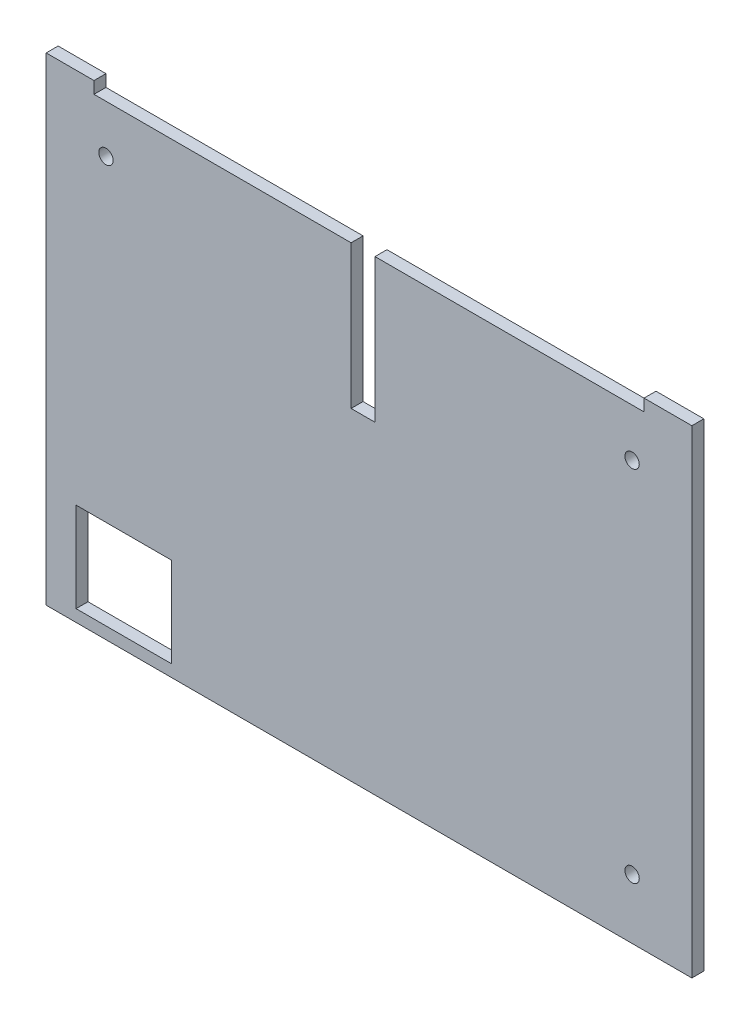
ISO-10303-21;
HEADER;
FILE_DESCRIPTION(('STEP AP214'),'2;1');
FILE_NAME('part.step','',(''),(''),'','','');
FILE_SCHEMA(('AUTOMOTIVE_DESIGN { 1 0 10303 214 1 1 1 1 }'));
ENDSEC;
DATA;
#1=APPLICATION_CONTEXT('core data for automotive mechanical design processes');
#2=APPLICATION_PROTOCOL_DEFINITION('international standard','automotive_design',2000,#1);
#3=PRODUCT_CONTEXT('',#1,'mechanical');
#4=PRODUCT('Part','Part','',(#3));
#5=PRODUCT_RELATED_PRODUCT_CATEGORY('part','',(#4));
#6=PRODUCT_DEFINITION_FORMATION('','',#4);
#7=PRODUCT_DEFINITION_CONTEXT('part definition',#1,'design');
#8=PRODUCT_DEFINITION('design','',#6,#7);
#9=PRODUCT_DEFINITION_SHAPE('','',#8);
#10=(LENGTH_UNIT() NAMED_UNIT(*) SI_UNIT(.MILLI.,.METRE.));
#11=(NAMED_UNIT(*) PLANE_ANGLE_UNIT() SI_UNIT($,.RADIAN.));
#12=(NAMED_UNIT(*) SI_UNIT($,.STERADIAN.) SOLID_ANGLE_UNIT());
#13=UNCERTAINTY_MEASURE_WITH_UNIT(LENGTH_MEASURE(1.E-05),#10,'distance_accuracy_value','');
#14=(GEOMETRIC_REPRESENTATION_CONTEXT(3) GLOBAL_UNCERTAINTY_ASSIGNED_CONTEXT((#13)) GLOBAL_UNIT_ASSIGNED_CONTEXT((#10,
#11,#12)) REPRESENTATION_CONTEXT('',''));
#15=CARTESIAN_POINT('',(0.,0.,0.));
#16=DIRECTION('',(0.,0.,1.));
#17=DIRECTION('',(1.,0.,0.));
#18=AXIS2_PLACEMENT_3D('',#15,#16,#17);
#19=CARTESIAN_POINT('',(0.,95.0000000000001,0.));
#20=DIRECTION('',(0.,1.,0.));
#21=DIRECTION('',(0.,0.,1.));
#22=AXIS2_PLACEMENT_3D('',#19,#20,#21);
#23=PLANE('',#22);
#24=DIRECTION('',(-1.,0.,0.));
#25=VECTOR('',#24,1.);
#26=CARTESIAN_POINT('',(-115.,95.0000000000001,0.));
#27=LINE('',#26,#25);
#28=CARTESIAN_POINT('',(115.,95.0000000000001,0.));
#29=VERTEX_POINT('',#28);
#30=CARTESIAN_POINT('',(2.5,95.0000000000001,0.));
#31=VERTEX_POINT('',#30);
#32=EDGE_CURVE('E185',#29,#31,#27,.T.);
#33=ORIENTED_EDGE('',*,*,#32,.T.);
#34=DIRECTION('',(0.,0.,-1.));
#35=VECTOR('',#34,1.);
#36=CARTESIAN_POINT('',(2.5,95.0000000000001,0.));
#37=LINE('',#36,#35);
#38=CARTESIAN_POINT('',(2.5,95.0000000000001,5.));
#39=VERTEX_POINT('',#38);
#40=EDGE_CURVE('E163',#39,#31,#37,.T.);
#41=ORIENTED_EDGE('',*,*,#40,.F.);
#42=DIRECTION('',(1.,0.,0.));
#43=VECTOR('',#42,1.);
#44=CARTESIAN_POINT('',(-115.,95.0000000000001,5.));
#45=LINE('',#44,#43);
#46=CARTESIAN_POINT('',(115.,95.0000000000001,5.));
#47=VERTEX_POINT('',#46);
#48=EDGE_CURVE('E162',#39,#47,#45,.T.);
#49=ORIENTED_EDGE('',*,*,#48,.T.);
#50=DIRECTION('',(0.,0.,-1.));
#51=VECTOR('',#50,1.);
#52=CARTESIAN_POINT('',(115.,95.0000000000001,0.));
#53=LINE('',#52,#51);
#54=EDGE_CURVE('E182',#47,#29,#53,.T.);
#55=ORIENTED_EDGE('',*,*,#54,.T.);
#56=EDGE_LOOP('',(#33,#41,#49,#55));
#57=FACE_BOUND('',#56,.T.);
#58=ADVANCED_FACE('F34',(#57),#23,.T.);
#59=CARTESIAN_POINT('',(0.,100.,5.));
#60=DIRECTION('',(0.,1.,0.));
#61=DIRECTION('',(0.,0.,1.));
#62=AXIS2_PLACEMENT_3D('',#59,#60,#61);
#63=PLANE('',#62);
#64=DIRECTION('',(0.,0.,1.));
#65=VECTOR('',#64,1.);
#66=CARTESIAN_POINT('',(-115.,100.,0.));
#67=LINE('',#66,#65);
#68=CARTESIAN_POINT('',(-115.,100.,0.));
#69=VERTEX_POINT('',#68);
#70=CARTESIAN_POINT('',(-115.,100.,5.));
#71=VERTEX_POINT('',#70);
#72=EDGE_CURVE('E168',#69,#71,#67,.T.);
#73=ORIENTED_EDGE('',*,*,#72,.F.);
#74=DIRECTION('',(1.,0.,0.));
#75=VECTOR('',#74,1.);
#76=CARTESIAN_POINT('',(0.,100.,0.));
#77=LINE('',#76,#75);
#78=CARTESIAN_POINT('',(-135.,100.,0.));
#79=VERTEX_POINT('',#78);
#80=EDGE_CURVE('E251',#79,#69,#77,.T.);
#81=ORIENTED_EDGE('',*,*,#80,.F.);
#82=DIRECTION('',(0.,0.,-1.));
#83=VECTOR('',#82,1.);
#84=CARTESIAN_POINT('',(-135.,100.,5.));
#85=LINE('',#84,#83);
#86=CARTESIAN_POINT('',(-135.,100.,5.));
#87=VERTEX_POINT('',#86);
#88=EDGE_CURVE('E249',#87,#79,#85,.T.);
#89=ORIENTED_EDGE('',*,*,#88,.F.);
#90=DIRECTION('',(1.,0.,0.));
#91=VECTOR('',#90,1.);
#92=CARTESIAN_POINT('',(0.,100.,5.));
#93=LINE('',#92,#91);
#94=EDGE_CURVE('E246',#87,#71,#93,.T.);
#95=ORIENTED_EDGE('',*,*,#94,.T.);
#96=EDGE_LOOP('',(#73,#81,#89,#95));
#97=FACE_BOUND('',#96,.T.);
#98=ADVANCED_FACE('F307',(#97),#63,.T.);
#99=CARTESIAN_POINT('',(0.,-99.9999999999999,5.));
#100=DIRECTION('',(0.,1.,0.));
#101=DIRECTION('',(0.,0.,1.));
#102=AXIS2_PLACEMENT_3D('',#99,#100,#101);
#103=PLANE('',#102);
#104=DIRECTION('',(1.,0.,0.));
#105=VECTOR('',#104,1.);
#106=CARTESIAN_POINT('',(0.,-99.9999999999999,0.));
#107=LINE('',#106,#105);
#108=CARTESIAN_POINT('',(-135.,-99.9999999999999,0.));
#109=VERTEX_POINT('',#108);
#110=CARTESIAN_POINT('',(135.,-99.9999999999999,0.));
#111=VERTEX_POINT('',#110);
#112=EDGE_CURVE('E234',#109,#111,#107,.T.);
#113=ORIENTED_EDGE('',*,*,#112,.T.);
#114=DIRECTION('',(0.,0.,-1.));
#115=VECTOR('',#114,1.);
#116=CARTESIAN_POINT('',(135.,-99.9999999999999,5.));
#117=LINE('',#116,#115);
#118=CARTESIAN_POINT('',(135.,-99.9999999999999,5.));
#119=VERTEX_POINT('',#118);
#120=EDGE_CURVE('E264',#119,#111,#117,.T.);
#121=ORIENTED_EDGE('',*,*,#120,.F.);
#122=DIRECTION('',(1.,0.,0.));
#123=VECTOR('',#122,1.);
#124=CARTESIAN_POINT('',(0.,-99.9999999999999,5.));
#125=LINE('',#124,#123);
#126=CARTESIAN_POINT('',(-135.,-99.9999999999999,5.));
#127=VERTEX_POINT('',#126);
#128=EDGE_CURVE('E239',#127,#119,#125,.T.);
#129=ORIENTED_EDGE('',*,*,#128,.F.);
#130=DIRECTION('',(0.,0.,-1.));
#131=VECTOR('',#130,1.);
#132=CARTESIAN_POINT('',(-135.,-99.9999999999999,5.));
#133=LINE('',#132,#131);
#134=EDGE_CURVE('E266',#127,#109,#133,.T.);
#135=ORIENTED_EDGE('',*,*,#134,.T.);
#136=EDGE_LOOP('',(#113,#121,#129,#135));
#137=FACE_BOUND('',#136,.T.);
#138=ADVANCED_FACE('F36',(#137),#103,.F.);
#139=CARTESIAN_POINT('',(135.,0.,5.));
#140=DIRECTION('',(1.,0.,0.));
#141=DIRECTION('',(0.,1.,0.));
#142=AXIS2_PLACEMENT_3D('',#139,#140,#141);
#143=PLANE('',#142);
#144=DIRECTION('',(0.,-1.,0.));
#145=VECTOR('',#144,1.);
#146=CARTESIAN_POINT('',(135.,0.,0.));
#147=LINE('',#146,#145);
#148=CARTESIAN_POINT('',(135.,100.,0.));
#149=VERTEX_POINT('',#148);
#150=EDGE_CURVE('E254',#149,#111,#147,.T.);
#151=ORIENTED_EDGE('',*,*,#150,.F.);
#152=DIRECTION('',(0.,0.,-1.));
#153=VECTOR('',#152,1.);
#154=CARTESIAN_POINT('',(135.,100.,5.));
#155=LINE('',#154,#153);
#156=CARTESIAN_POINT('',(135.,100.,5.));
#157=VERTEX_POINT('',#156);
#158=EDGE_CURVE('E261',#157,#149,#155,.T.);
#159=ORIENTED_EDGE('',*,*,#158,.F.);
#160=DIRECTION('',(0.,-1.,0.));
#161=VECTOR('',#160,1.);
#162=CARTESIAN_POINT('',(135.,0.,5.));
#163=LINE('',#162,#161);
#164=EDGE_CURVE('E242',#157,#119,#163,.T.);
#165=ORIENTED_EDGE('',*,*,#164,.T.);
#166=ORIENTED_EDGE('',*,*,#120,.T.);
#167=EDGE_LOOP('',(#151,#159,#165,#166));
#168=FACE_BOUND('',#167,.T.);
#169=ADVANCED_FACE('F364',(#168),#143,.T.);
#170=DIRECTION('',(0.,0.,-1.));
#171=VECTOR('',#170,1.);
#172=CARTESIAN_POINT('',(115.,100.,0.));
#173=LINE('',#172,#171);
#174=CARTESIAN_POINT('',(115.,100.,5.));
#175=VERTEX_POINT('',#174);
#176=CARTESIAN_POINT('',(115.,100.,0.));
#177=VERTEX_POINT('',#176);
#178=EDGE_CURVE('E171',#175,#177,#173,.T.);
#179=ORIENTED_EDGE('',*,*,#178,.F.);
#180=EDGE_CURVE('E245',#175,#157,#93,.T.);
#181=ORIENTED_EDGE('',*,*,#180,.T.);
#182=ORIENTED_EDGE('',*,*,#158,.T.);
#183=EDGE_CURVE('E257',#177,#149,#77,.T.);
#184=ORIENTED_EDGE('',*,*,#183,.F.);
#185=EDGE_LOOP('',(#179,#181,#182,#184));
#186=FACE_BOUND('',#185,.T.);
#187=ADVANCED_FACE('F318',(#186),#63,.T.);
#188=CARTESIAN_POINT('',(-135.,0.,5.));
#189=DIRECTION('',(1.,0.,0.));
#190=DIRECTION('',(0.,1.,0.));
#191=AXIS2_PLACEMENT_3D('',#188,#189,#190);
#192=PLANE('',#191);
#193=DIRECTION('',(0.,-1.,0.));
#194=VECTOR('',#193,1.);
#195=CARTESIAN_POINT('',(-135.,0.,0.));
#196=LINE('',#195,#194);
#197=EDGE_CURVE('E240',#79,#109,#196,.T.);
#198=ORIENTED_EDGE('',*,*,#197,.T.);
#199=ORIENTED_EDGE('',*,*,#134,.F.);
#200=DIRECTION('',(0.,-1.,0.));
#201=VECTOR('',#200,1.);
#202=CARTESIAN_POINT('',(-135.,0.,5.));
#203=LINE('',#202,#201);
#204=EDGE_CURVE('E237',#87,#127,#203,.T.);
#205=ORIENTED_EDGE('',*,*,#204,.F.);
#206=ORIENTED_EDGE('',*,*,#88,.T.);
#207=EDGE_LOOP('',(#198,#199,#205,#206));
#208=FACE_BOUND('',#207,.T.);
#209=ADVANCED_FACE('F368',(#208),#192,.F.);
#210=CARTESIAN_POINT('',(0.,0.,5.));
#211=DIRECTION('',(0.,0.,1.));
#212=DIRECTION('',(1.,0.,0.));
#213=AXIS2_PLACEMENT_3D('',#210,#211,#212);
#214=PLANE('',#213);
#215=ORIENTED_EDGE('',*,*,#48,.F.);
#216=DIRECTION('',(0.,1.,0.));
#217=VECTOR('',#216,1.);
#218=CARTESIAN_POINT('',(2.5,95.0000000000001,5.));
#219=LINE('',#218,#217);
#220=CARTESIAN_POINT('',(2.49999999999998,35.0000000000001,5.));
#221=VERTEX_POINT('',#220);
#222=EDGE_CURVE('E149',#221,#39,#219,.T.);
#223=ORIENTED_EDGE('',*,*,#222,.F.);
#224=DIRECTION('',(1.,0.,0.));
#225=VECTOR('',#224,1.);
#226=CARTESIAN_POINT('',(0.,35.0000000000001,5.));
#227=LINE('',#226,#225);
#228=CARTESIAN_POINT('',(-7.50000000000001,35.0000000000001,5.));
#229=VERTEX_POINT('',#228);
#230=EDGE_CURVE('E160',#229,#221,#227,.T.);
#231=ORIENTED_EDGE('',*,*,#230,.F.);
#232=DIRECTION('',(0.,-1.,0.));
#233=VECTOR('',#232,1.);
#234=CARTESIAN_POINT('',(-7.50000000000001,0.,5.));
#235=LINE('',#234,#233);
#236=CARTESIAN_POINT('',(-7.5,95.0000000000001,5.));
#237=VERTEX_POINT('',#236);
#238=EDGE_CURVE('E169',#237,#229,#235,.T.);
#239=ORIENTED_EDGE('',*,*,#238,.F.);
#240=CARTESIAN_POINT('',(-115.,95.0000000000001,5.));
#241=VERTEX_POINT('',#240);
#242=EDGE_CURVE('E179',#241,#237,#45,.T.);
#243=ORIENTED_EDGE('',*,*,#242,.F.);
#244=DIRECTION('',(0.,1.,0.));
#245=VECTOR('',#244,1.);
#246=CARTESIAN_POINT('',(-115.,95.0000000000001,5.));
#247=LINE('',#246,#245);
#248=EDGE_CURVE('E186',#241,#71,#247,.T.);
#249=ORIENTED_EDGE('',*,*,#248,.T.);
#250=ORIENTED_EDGE('',*,*,#94,.F.);
#251=ORIENTED_EDGE('',*,*,#204,.T.);
#252=ORIENTED_EDGE('',*,*,#128,.T.);
#253=ORIENTED_EDGE('',*,*,#164,.F.);
#254=ORIENTED_EDGE('',*,*,#180,.F.);
#255=DIRECTION('',(0.,1.,0.));
#256=VECTOR('',#255,1.);
#257=CARTESIAN_POINT('',(115.,95.0000000000001,5.));
#258=LINE('',#257,#256);
#259=EDGE_CURVE('E195',#47,#175,#258,.T.);
#260=ORIENTED_EDGE('',*,*,#259,.F.);
#261=EDGE_LOOP('',(#215,#223,#231,#239,#243,#249,#250,#251,#252,#253,#254,#260));
#262=FACE_BOUND('',#261,.T.);
#263=DIRECTION('',(0.,1.,0.));
#264=VECTOR('',#263,1.);
#265=CARTESIAN_POINT('',(-82.4999999999999,-94.9999999999999,5.));
#266=LINE('',#265,#264);
#267=CARTESIAN_POINT('',(-82.4999999999999,-94.9999999999999,5.));
#268=VERTEX_POINT('',#267);
#269=CARTESIAN_POINT('',(-82.4999999999999,-57.5000000000002,5.));
#270=VERTEX_POINT('',#269);
#271=EDGE_CURVE('E191',#268,#270,#266,.T.);
#272=ORIENTED_EDGE('',*,*,#271,.F.);
#273=DIRECTION('',(1.,0.,0.));
#274=VECTOR('',#273,1.);
#275=CARTESIAN_POINT('',(-82.4999999999999,-94.9999999999999,5.));
#276=LINE('',#275,#274);
#277=CARTESIAN_POINT('',(-122.5,-94.9999999999999,5.));
#278=VERTEX_POINT('',#277);
#279=EDGE_CURVE('E206',#278,#268,#276,.T.);
#280=ORIENTED_EDGE('',*,*,#279,.F.);
#281=DIRECTION('',(0.,-1.,0.));
#282=VECTOR('',#281,1.);
#283=CARTESIAN_POINT('',(-122.5,-94.9999999999999,5.));
#284=LINE('',#283,#282);
#285=CARTESIAN_POINT('',(-122.5,-57.5000000000002,5.));
#286=VERTEX_POINT('',#285);
#287=EDGE_CURVE('E203',#286,#278,#284,.T.);
#288=ORIENTED_EDGE('',*,*,#287,.F.);
#289=DIRECTION('',(-1.,0.,0.));
#290=VECTOR('',#289,1.);
#291=CARTESIAN_POINT('',(-82.4999999999999,-57.5000000000002,5.));
#292=LINE('',#291,#290);
#293=EDGE_CURVE('E200',#270,#286,#292,.T.);
#294=ORIENTED_EDGE('',*,*,#293,.F.);
#295=EDGE_LOOP('',(#272,#280,#288,#294));
#296=FACE_BOUND('',#295,.T.);
#297=CARTESIAN_POINT('',(110.,75.,5.));
#298=DIRECTION('',(0.,0.,-1.));
#299=DIRECTION('',(1.,0.,0.));
#300=AXIS2_PLACEMENT_3D('',#297,#298,#299);
#301=CIRCLE('',#300,3.00000000000001);
#302=CARTESIAN_POINT('',(113.,75.,5.));
#303=VERTEX_POINT('',#302);
#304=EDGE_CURVE('E212',#303,#303,#301,.T.);
#305=ORIENTED_EDGE('',*,*,#304,.T.);
#306=EDGE_LOOP('',(#305));
#307=FACE_BOUND('',#306,.T.);
#308=CARTESIAN_POINT('',(-110.,75.,5.));
#309=DIRECTION('',(0.,0.,1.));
#310=DIRECTION('',(-1.,0.,0.));
#311=AXIS2_PLACEMENT_3D('',#308,#309,#310);
#312=CIRCLE('',#311,3.00000000000001);
#313=CARTESIAN_POINT('',(-113.,75.,5.));
#314=VERTEX_POINT('',#313);
#315=EDGE_CURVE('E222',#314,#314,#312,.T.);
#316=ORIENTED_EDGE('',*,*,#315,.F.);
#317=EDGE_LOOP('',(#316));
#318=FACE_BOUND('',#317,.T.);
#319=CARTESIAN_POINT('',(110.,-75.,5.));
#320=DIRECTION('',(0.,0.,1.));
#321=DIRECTION('',(1.,0.,0.));
#322=AXIS2_PLACEMENT_3D('',#319,#320,#321);
#323=CIRCLE('',#322,3.00000000000001);
#324=CARTESIAN_POINT('',(113.,-75.,5.));
#325=VERTEX_POINT('',#324);
#326=EDGE_CURVE('E228',#325,#325,#323,.T.);
#327=ORIENTED_EDGE('',*,*,#326,.F.);
#328=EDGE_LOOP('',(#327));
#329=FACE_BOUND('',#328,.T.);
#330=ADVANCED_FACE('F157',(#262,#296,#307,#318,#329),#214,.T.);
#331=CARTESIAN_POINT('',(0.,0.,0.));
#332=DIRECTION('',(0.,0.,1.));
#333=DIRECTION('',(1.,0.,0.));
#334=AXIS2_PLACEMENT_3D('',#331,#332,#333);
#335=PLANE('',#334);
#336=DIRECTION('',(-1.,0.,0.));
#337=VECTOR('',#336,1.);
#338=CARTESIAN_POINT('',(7.49999999999998,35.0000000000001,0.));
#339=LINE('',#338,#337);
#340=CARTESIAN_POINT('',(2.49999999999998,35.0000000000001,0.));
#341=VERTEX_POINT('',#340);
#342=CARTESIAN_POINT('',(-7.50000000000001,35.0000000000001,0.));
#343=VERTEX_POINT('',#342);
#344=EDGE_CURVE('E346',#341,#343,#339,.T.);
#345=ORIENTED_EDGE('',*,*,#344,.F.);
#346=DIRECTION('',(0.,-1.,0.));
#347=VECTOR('',#346,1.);
#348=CARTESIAN_POINT('',(2.5,95.0000000000001,0.));
#349=LINE('',#348,#347);
#350=EDGE_CURVE('E49',#31,#341,#349,.T.);
#351=ORIENTED_EDGE('',*,*,#350,.F.);
#352=ORIENTED_EDGE('',*,*,#32,.F.);
#353=DIRECTION('',(0.,1.,0.));
#354=VECTOR('',#353,1.);
#355=CARTESIAN_POINT('',(115.,95.0000000000001,0.));
#356=LINE('',#355,#354);
#357=EDGE_CURVE('E192',#29,#177,#356,.T.);
#358=ORIENTED_EDGE('',*,*,#357,.T.);
#359=ORIENTED_EDGE('',*,*,#183,.T.);
#360=ORIENTED_EDGE('',*,*,#150,.T.);
#361=ORIENTED_EDGE('',*,*,#112,.F.);
#362=ORIENTED_EDGE('',*,*,#197,.F.);
#363=ORIENTED_EDGE('',*,*,#80,.T.);
#364=DIRECTION('',(0.,1.,0.));
#365=VECTOR('',#364,1.);
#366=CARTESIAN_POINT('',(-115.,95.0000000000001,0.));
#367=LINE('',#366,#365);
#368=CARTESIAN_POINT('',(-115.,95.0000000000001,0.));
#369=VERTEX_POINT('',#368);
#370=EDGE_CURVE('E189',#369,#69,#367,.T.);
#371=ORIENTED_EDGE('',*,*,#370,.F.);
#372=CARTESIAN_POINT('',(-7.50000000000001,95.0000000000001,0.));
#373=VERTEX_POINT('',#372);
#374=EDGE_CURVE('E184',#373,#369,#27,.T.);
#375=ORIENTED_EDGE('',*,*,#374,.F.);
#376=DIRECTION('',(0.,1.,0.));
#377=VECTOR('',#376,1.);
#378=CARTESIAN_POINT('',(-7.5,95.0000000000001,0.));
#379=LINE('',#378,#377);
#380=EDGE_CURVE('E56',#343,#373,#379,.T.);
#381=ORIENTED_EDGE('',*,*,#380,.F.);
#382=EDGE_LOOP('',(#345,#351,#352,#358,#359,#360,#361,#362,#363,#371,#375,#381));
#383=FACE_BOUND('',#382,.T.);
#384=CARTESIAN_POINT('',(110.,-75.,0.));
#385=DIRECTION('',(0.,0.,1.));
#386=DIRECTION('',(1.,0.,0.));
#387=AXIS2_PLACEMENT_3D('',#384,#385,#386);
#388=CIRCLE('',#387,3.00000000000001);
#389=CARTESIAN_POINT('',(113.,-75.,0.));
#390=VERTEX_POINT('',#389);
#391=EDGE_CURVE('E231',#390,#390,#388,.T.);
#392=ORIENTED_EDGE('',*,*,#391,.T.);
#393=EDGE_LOOP('',(#392));
#394=FACE_BOUND('',#393,.T.);
#395=CARTESIAN_POINT('',(-110.,75.,0.));
#396=DIRECTION('',(0.,0.,1.));
#397=DIRECTION('',(-1.,0.,0.));
#398=AXIS2_PLACEMENT_3D('',#395,#396,#397);
#399=CIRCLE('',#398,3.00000000000001);
#400=CARTESIAN_POINT('',(-113.,75.,0.));
#401=VERTEX_POINT('',#400);
#402=EDGE_CURVE('E225',#401,#401,#399,.T.);
#403=ORIENTED_EDGE('',*,*,#402,.T.);
#404=EDGE_LOOP('',(#403));
#405=FACE_BOUND('',#404,.T.);
#406=CARTESIAN_POINT('',(110.,75.,0.));
#407=DIRECTION('',(0.,0.,-1.));
#408=DIRECTION('',(1.,0.,0.));
#409=AXIS2_PLACEMENT_3D('',#406,#407,#408);
#410=CIRCLE('',#409,3.00000000000001);
#411=CARTESIAN_POINT('',(113.,75.,0.));
#412=VERTEX_POINT('',#411);
#413=EDGE_CURVE('E219',#412,#412,#410,.T.);
#414=ORIENTED_EDGE('',*,*,#413,.F.);
#415=EDGE_LOOP('',(#414));
#416=FACE_BOUND('',#415,.T.);
#417=DIRECTION('',(1.,0.,0.));
#418=VECTOR('',#417,1.);
#419=CARTESIAN_POINT('',(0.,-94.9999999999999,0.));
#420=LINE('',#419,#418);
#421=CARTESIAN_POINT('',(-122.5,-94.9999999999999,0.));
#422=VERTEX_POINT('',#421);
#423=CARTESIAN_POINT('',(-82.4999999999999,-94.9999999999999,0.));
#424=VERTEX_POINT('',#423);
#425=EDGE_CURVE('E275',#422,#424,#420,.T.);
#426=ORIENTED_EDGE('',*,*,#425,.T.);
#427=DIRECTION('',(0.,1.,0.));
#428=VECTOR('',#427,1.);
#429=CARTESIAN_POINT('',(-82.4999999999999,0.,0.));
#430=LINE('',#429,#428);
#431=CARTESIAN_POINT('',(-82.4999999999999,-57.5000000000002,0.));
#432=VERTEX_POINT('',#431);
#433=EDGE_CURVE('E42',#424,#432,#430,.T.);
#434=ORIENTED_EDGE('',*,*,#433,.T.);
#435=DIRECTION('',(-1.,0.,0.));
#436=VECTOR('',#435,1.);
#437=CARTESIAN_POINT('',(0.,-57.5000000000002,0.));
#438=LINE('',#437,#436);
#439=CARTESIAN_POINT('',(-122.5,-57.5000000000002,0.));
#440=VERTEX_POINT('',#439);
#441=EDGE_CURVE('E269',#432,#440,#438,.T.);
#442=ORIENTED_EDGE('',*,*,#441,.T.);
#443=DIRECTION('',(0.,-1.,0.));
#444=VECTOR('',#443,1.);
#445=CARTESIAN_POINT('',(-122.5,0.,0.));
#446=LINE('',#445,#444);
#447=EDGE_CURVE('E272',#440,#422,#446,.T.);
#448=ORIENTED_EDGE('',*,*,#447,.T.);
#449=EDGE_LOOP('',(#426,#434,#442,#448));
#450=FACE_BOUND('',#449,.T.);
#451=ADVANCED_FACE('F279',(#383,#394,#405,#416,#450),#335,.F.);
#452=CARTESIAN_POINT('',(110.,-75.,0.));
#453=DIRECTION('',(0.,0.,1.));
#454=DIRECTION('',(1.,0.,0.));
#455=AXIS2_PLACEMENT_3D('',#452,#453,#454);
#456=CYLINDRICAL_SURFACE('',#455,3.00000000000001);
#457=ORIENTED_EDGE('',*,*,#391,.F.);
#458=EDGE_LOOP('',(#457));
#459=FACE_BOUND('',#458,.T.);
#460=ORIENTED_EDGE('',*,*,#326,.T.);
#461=EDGE_LOOP('',(#460));
#462=FACE_BOUND('',#461,.T.);
#463=ADVANCED_FACE('F395',(#459,#462),#456,.F.);
#464=CARTESIAN_POINT('',(-110.,75.,0.));
#465=DIRECTION('',(0.,0.,1.));
#466=DIRECTION('',(1.,0.,0.));
#467=AXIS2_PLACEMENT_3D('',#464,#465,#466);
#468=CYLINDRICAL_SURFACE('',#467,3.00000000000001);
#469=ORIENTED_EDGE('',*,*,#402,.F.);
#470=EDGE_LOOP('',(#469));
#471=FACE_BOUND('',#470,.T.);
#472=ORIENTED_EDGE('',*,*,#315,.T.);
#473=EDGE_LOOP('',(#472));
#474=FACE_BOUND('',#473,.T.);
#475=ADVANCED_FACE('F400',(#471,#474),#468,.F.);
#476=CARTESIAN_POINT('',(110.,75.,0.));
#477=DIRECTION('',(0.,0.,1.));
#478=DIRECTION('',(1.,0.,0.));
#479=AXIS2_PLACEMENT_3D('',#476,#477,#478);
#480=CYLINDRICAL_SURFACE('',#479,3.00000000000001);
#481=ORIENTED_EDGE('',*,*,#413,.T.);
#482=EDGE_LOOP('',(#481));
#483=FACE_BOUND('',#482,.T.);
#484=ORIENTED_EDGE('',*,*,#304,.F.);
#485=EDGE_LOOP('',(#484));
#486=FACE_BOUND('',#485,.T.);
#487=ADVANCED_FACE('F411',(#483,#486),#480,.F.);
#488=CARTESIAN_POINT('',(-82.4999999999999,-94.9999999999999,-55.));
#489=DIRECTION('',(1.,0.,0.));
#490=DIRECTION('',(0.,0.,-1.));
#491=AXIS2_PLACEMENT_3D('',#488,#489,#490);
#492=PLANE('',#491);
#493=DIRECTION('',(0.,0.,1.));
#494=VECTOR('',#493,1.);
#495=CARTESIAN_POINT('',(-82.4999999999999,-94.9999999999999,-55.));
#496=LINE('',#495,#494);
#497=EDGE_CURVE('E210',#424,#268,#496,.T.);
#498=ORIENTED_EDGE('',*,*,#497,.T.);
#499=ORIENTED_EDGE('',*,*,#271,.T.);
#500=DIRECTION('',(0.,0.,1.));
#501=VECTOR('',#500,1.);
#502=CARTESIAN_POINT('',(-82.4999999999999,-57.5000000000002,-55.));
#503=LINE('',#502,#501);
#504=EDGE_CURVE('E209',#432,#270,#503,.T.);
#505=ORIENTED_EDGE('',*,*,#504,.F.);
#506=ORIENTED_EDGE('',*,*,#433,.F.);
#507=EDGE_LOOP('',(#498,#499,#505,#506));
#508=FACE_BOUND('',#507,.T.);
#509=ADVANCED_FACE('F283',(#508),#492,.F.);
#510=CARTESIAN_POINT('',(-82.4999999999999,-94.9999999999999,-55.));
#511=DIRECTION('',(0.,-1.,0.));
#512=DIRECTION('',(0.,0.,-1.));
#513=AXIS2_PLACEMENT_3D('',#510,#511,#512);
#514=PLANE('',#513);
#515=DIRECTION('',(0.,0.,1.));
#516=VECTOR('',#515,1.);
#517=CARTESIAN_POINT('',(-122.5,-94.9999999999999,-55.));
#518=LINE('',#517,#516);
#519=EDGE_CURVE('E213',#422,#278,#518,.T.);
#520=ORIENTED_EDGE('',*,*,#519,.T.);
#521=ORIENTED_EDGE('',*,*,#279,.T.);
#522=ORIENTED_EDGE('',*,*,#497,.F.);
#523=ORIENTED_EDGE('',*,*,#425,.F.);
#524=EDGE_LOOP('',(#520,#521,#522,#523));
#525=FACE_BOUND('',#524,.T.);
#526=ADVANCED_FACE('F285',(#525),#514,.F.);
#527=CARTESIAN_POINT('',(-122.5,-94.9999999999999,-55.));
#528=DIRECTION('',(-1.,0.,0.));
#529=DIRECTION('',(0.,0.,1.));
#530=AXIS2_PLACEMENT_3D('',#527,#528,#529);
#531=PLANE('',#530);
#532=DIRECTION('',(0.,0.,1.));
#533=VECTOR('',#532,1.);
#534=CARTESIAN_POINT('',(-122.5,-57.5000000000002,-55.));
#535=LINE('',#534,#533);
#536=EDGE_CURVE('E215',#440,#286,#535,.T.);
#537=ORIENTED_EDGE('',*,*,#536,.T.);
#538=ORIENTED_EDGE('',*,*,#287,.T.);
#539=ORIENTED_EDGE('',*,*,#519,.F.);
#540=ORIENTED_EDGE('',*,*,#447,.F.);
#541=EDGE_LOOP('',(#537,#538,#539,#540));
#542=FACE_BOUND('',#541,.T.);
#543=ADVANCED_FACE('F296',(#542),#531,.F.);
#544=CARTESIAN_POINT('',(-82.4999999999999,-57.5000000000002,-55.));
#545=DIRECTION('',(0.,1.,0.));
#546=DIRECTION('',(0.,0.,1.));
#547=AXIS2_PLACEMENT_3D('',#544,#545,#546);
#548=PLANE('',#547);
#549=ORIENTED_EDGE('',*,*,#504,.T.);
#550=ORIENTED_EDGE('',*,*,#293,.T.);
#551=ORIENTED_EDGE('',*,*,#536,.F.);
#552=ORIENTED_EDGE('',*,*,#441,.F.);
#553=EDGE_LOOP('',(#549,#550,#551,#552));
#554=FACE_BOUND('',#553,.T.);
#555=ADVANCED_FACE('F293',(#554),#548,.F.);
#556=CARTESIAN_POINT('',(-115.,95.0000000000001,0.));
#557=DIRECTION('',(-1.,0.,0.));
#558=DIRECTION('',(0.,0.,1.));
#559=AXIS2_PLACEMENT_3D('',#556,#557,#558);
#560=PLANE('',#559);
#561=ORIENTED_EDGE('',*,*,#72,.T.);
#562=ORIENTED_EDGE('',*,*,#248,.F.);
#563=DIRECTION('',(0.,0.,1.));
#564=VECTOR('',#563,1.);
#565=CARTESIAN_POINT('',(-115.,95.0000000000001,0.));
#566=LINE('',#565,#564);
#567=EDGE_CURVE('E176',#369,#241,#566,.T.);
#568=ORIENTED_EDGE('',*,*,#567,.F.);
#569=ORIENTED_EDGE('',*,*,#370,.T.);
#570=EDGE_LOOP('',(#561,#562,#568,#569));
#571=FACE_BOUND('',#570,.T.);
#572=ADVANCED_FACE('F303',(#571),#560,.F.);
#573=CARTESIAN_POINT('',(115.,95.0000000000001,0.));
#574=DIRECTION('',(1.,0.,0.));
#575=DIRECTION('',(0.,0.,-1.));
#576=AXIS2_PLACEMENT_3D('',#573,#574,#575);
#577=PLANE('',#576);
#578=ORIENTED_EDGE('',*,*,#178,.T.);
#579=ORIENTED_EDGE('',*,*,#357,.F.);
#580=ORIENTED_EDGE('',*,*,#54,.F.);
#581=ORIENTED_EDGE('',*,*,#259,.T.);
#582=EDGE_LOOP('',(#578,#579,#580,#581));
#583=FACE_BOUND('',#582,.T.);
#584=ADVANCED_FACE('F323',(#583),#577,.F.);
#585=DIRECTION('',(0.,0.,1.));
#586=VECTOR('',#585,1.);
#587=CARTESIAN_POINT('',(-7.5,95.0000000000001,0.));
#588=LINE('',#587,#586);
#589=EDGE_CURVE('E11',#373,#237,#588,.T.);
#590=ORIENTED_EDGE('',*,*,#589,.F.);
#591=ORIENTED_EDGE('',*,*,#374,.T.);
#592=ORIENTED_EDGE('',*,*,#567,.T.);
#593=ORIENTED_EDGE('',*,*,#242,.T.);
#594=EDGE_LOOP('',(#590,#591,#592,#593));
#595=FACE_BOUND('',#594,.T.);
#596=ADVANCED_FACE('F310',(#595),#23,.T.);
#597=CARTESIAN_POINT('',(-7.5,95.0000000000001,10.));
#598=DIRECTION('',(-1.,0.,0.));
#599=DIRECTION('',(0.,-1.,0.));
#600=AXIS2_PLACEMENT_3D('',#597,#598,#599);
#601=PLANE('',#600);
#602=ORIENTED_EDGE('',*,*,#238,.T.);
#603=DIRECTION('',(0.,0.,-1.));
#604=VECTOR('',#603,1.);
#605=CARTESIAN_POINT('',(-7.50000000000001,35.0000000000001,10.));
#606=LINE('',#605,#604);
#607=EDGE_CURVE('E167',#229,#343,#606,.T.);
#608=ORIENTED_EDGE('',*,*,#607,.T.);
#609=ORIENTED_EDGE('',*,*,#380,.T.);
#610=ORIENTED_EDGE('',*,*,#589,.T.);
#611=EDGE_LOOP('',(#602,#608,#609,#610));
#612=FACE_BOUND('',#611,.T.);
#613=ADVANCED_FACE('F322',(#612),#601,.F.);
#614=CARTESIAN_POINT('',(7.49999999999998,35.0000000000001,10.));
#615=DIRECTION('',(0.,-1.,0.));
#616=DIRECTION('',(0.,0.,-1.));
#617=AXIS2_PLACEMENT_3D('',#614,#615,#616);
#618=PLANE('',#617);
#619=ORIENTED_EDGE('',*,*,#230,.T.);
#620=DIRECTION('',(0.,0.,1.));
#621=VECTOR('',#620,1.);
#622=CARTESIAN_POINT('',(2.49999999999998,35.0000000000001,0.));
#623=LINE('',#622,#621);
#624=EDGE_CURVE('E146',#341,#221,#623,.T.);
#625=ORIENTED_EDGE('',*,*,#624,.F.);
#626=ORIENTED_EDGE('',*,*,#344,.T.);
#627=ORIENTED_EDGE('',*,*,#607,.F.);
#628=EDGE_LOOP('',(#619,#625,#626,#627));
#629=FACE_BOUND('',#628,.T.);
#630=ADVANCED_FACE('F166',(#629),#618,.F.);
#631=CARTESIAN_POINT('',(2.49999999999998,0.,0.));
#632=DIRECTION('',(-1.,0.,0.));
#633=DIRECTION('',(0.,-1.,0.));
#634=AXIS2_PLACEMENT_3D('',#631,#632,#633);
#635=PLANE('',#634);
#636=ORIENTED_EDGE('',*,*,#350,.T.);
#637=ORIENTED_EDGE('',*,*,#624,.T.);
#638=ORIENTED_EDGE('',*,*,#222,.T.);
#639=ORIENTED_EDGE('',*,*,#40,.T.);
#640=EDGE_LOOP('',(#636,#637,#638,#639));
#641=FACE_BOUND('',#640,.T.);
#642=ADVANCED_FACE('F148',(#641),#635,.T.);
#643=CLOSED_SHELL('',(#58,#98,#138,#169,#187,#209,#330,#451,#463,#475,#487,#509,#526,#543,#555,
#572,#584,#596,#613,#630,#642));
#644=MANIFOLD_SOLID_BREP('B2',#643);
#645=ADVANCED_BREP_SHAPE_REPRESENTATION('',(#18,#644),#14);
#646=SHAPE_DEFINITION_REPRESENTATION(#9,#645);
ENDSEC;
END-ISO-10303-21;
